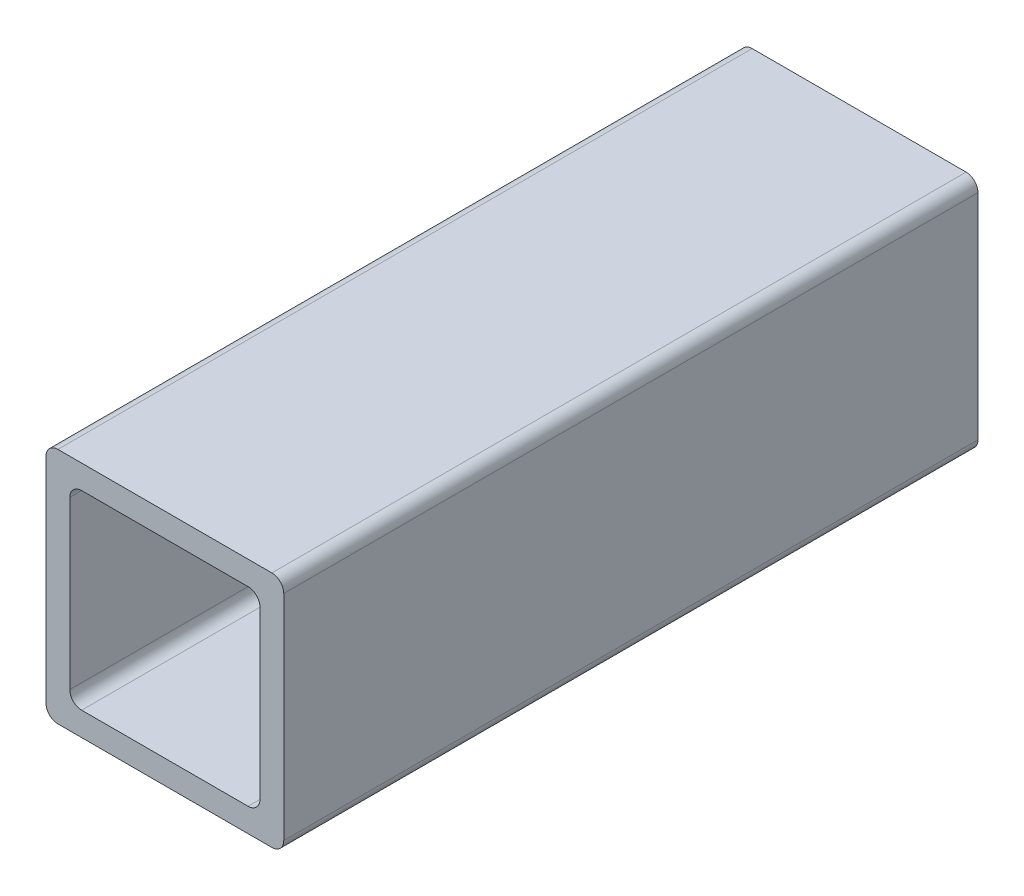
ISO-10303-21;
HEADER;
FILE_DESCRIPTION(('STEP AP214'),'2;1');
FILE_NAME('part.step','',(''),(''),'','','');
FILE_SCHEMA(('AUTOMOTIVE_DESIGN { 1 0 10303 214 1 1 1 1 }'));
ENDSEC;
DATA;
#1=APPLICATION_CONTEXT('core data for automotive mechanical design processes');
#2=APPLICATION_PROTOCOL_DEFINITION('international standard','automotive_design',2000,#1);
#3=PRODUCT_CONTEXT('',#1,'mechanical');
#4=PRODUCT('Part','Part','',(#3));
#5=PRODUCT_RELATED_PRODUCT_CATEGORY('part','',(#4));
#6=PRODUCT_DEFINITION_FORMATION('','',#4);
#7=PRODUCT_DEFINITION_CONTEXT('part definition',#1,'design');
#8=PRODUCT_DEFINITION('design','',#6,#7);
#9=PRODUCT_DEFINITION_SHAPE('','',#8);
#10=(LENGTH_UNIT() NAMED_UNIT(*) SI_UNIT(.MILLI.,.METRE.));
#11=(NAMED_UNIT(*) PLANE_ANGLE_UNIT() SI_UNIT($,.RADIAN.));
#12=(NAMED_UNIT(*) SI_UNIT($,.STERADIAN.) SOLID_ANGLE_UNIT());
#13=UNCERTAINTY_MEASURE_WITH_UNIT(LENGTH_MEASURE(1.E-05),#10,'distance_accuracy_value','');
#14=(GEOMETRIC_REPRESENTATION_CONTEXT(3) GLOBAL_UNCERTAINTY_ASSIGNED_CONTEXT((#13)) GLOBAL_UNIT_ASSIGNED_CONTEXT((#10,
#11,#12)) REPRESENTATION_CONTEXT('',''));
#15=CARTESIAN_POINT('',(0.,0.,0.));
#16=DIRECTION('',(0.,0.,1.));
#17=DIRECTION('',(1.,0.,0.));
#18=AXIS2_PLACEMENT_3D('',#15,#16,#17);
#19=CARTESIAN_POINT('',(0.,0.,-3.048));
#20=DIRECTION('',(0.,0.,1.));
#21=DIRECTION('',(1.,0.,0.));
#22=AXIS2_PLACEMENT_3D('',#19,#20,#21);
#23=PLANE('',#22);
#24=DIRECTION('',(0.,1.,0.));
#25=VECTOR('',#24,1.);
#26=CARTESIAN_POINT('',(12.7,-12.7,-3.048));
#27=LINE('',#26,#25);
#28=CARTESIAN_POINT('',(12.7,-11.43,-3.048));
#29=VERTEX_POINT('',#28);
#30=CARTESIAN_POINT('',(12.7,11.43,-3.048));
#31=VERTEX_POINT('',#30);
#32=EDGE_CURVE('E311',#29,#31,#27,.T.);
#33=ORIENTED_EDGE('',*,*,#32,.F.);
#34=CARTESIAN_POINT('',(11.43,-11.43,-3.048));
#35=DIRECTION('',(0.,0.,1.));
#36=DIRECTION('',(1.,0.,0.));
#37=AXIS2_PLACEMENT_3D('',#34,#35,#36);
#38=CIRCLE('',#37,1.27);
#39=CARTESIAN_POINT('',(11.43,-12.7,-3.048));
#40=VERTEX_POINT('',#39);
#41=EDGE_CURVE('E230',#29,#40,#38,.F.);
#42=ORIENTED_EDGE('',*,*,#41,.T.);
#43=DIRECTION('',(1.,0.,0.));
#44=VECTOR('',#43,1.);
#45=CARTESIAN_POINT('',(12.7,-12.7,-3.048));
#46=LINE('',#45,#44);
#47=CARTESIAN_POINT('',(-11.43,-12.7,-3.048));
#48=VERTEX_POINT('',#47);
#49=EDGE_CURVE('E316',#48,#40,#46,.T.);
#50=ORIENTED_EDGE('',*,*,#49,.F.);
#51=CARTESIAN_POINT('',(-11.43,-11.43,-3.048));
#52=DIRECTION('',(0.,0.,1.));
#53=DIRECTION('',(1.,0.,0.));
#54=AXIS2_PLACEMENT_3D('',#51,#52,#53);
#55=CIRCLE('',#54,1.27);
#56=CARTESIAN_POINT('',(-12.7,-11.43,-3.048));
#57=VERTEX_POINT('',#56);
#58=EDGE_CURVE('E227',#48,#57,#55,.F.);
#59=ORIENTED_EDGE('',*,*,#58,.T.);
#60=DIRECTION('',(0.,-1.,0.));
#61=VECTOR('',#60,1.);
#62=CARTESIAN_POINT('',(-12.7,-12.7,-3.048));
#63=LINE('',#62,#61);
#64=CARTESIAN_POINT('',(-12.7,11.43,-3.048));
#65=VERTEX_POINT('',#64);
#66=EDGE_CURVE('E321',#65,#57,#63,.T.);
#67=ORIENTED_EDGE('',*,*,#66,.F.);
#68=CARTESIAN_POINT('',(-11.43,11.43,-3.048));
#69=DIRECTION('',(0.,0.,1.));
#70=DIRECTION('',(1.,0.,0.));
#71=AXIS2_PLACEMENT_3D('',#68,#69,#70);
#72=CIRCLE('',#71,1.27);
#73=CARTESIAN_POINT('',(-11.43,12.7,-3.048));
#74=VERTEX_POINT('',#73);
#75=EDGE_CURVE('E221',#65,#74,#72,.F.);
#76=ORIENTED_EDGE('',*,*,#75,.T.);
#77=DIRECTION('',(-1.,0.,0.));
#78=VECTOR('',#77,1.);
#79=CARTESIAN_POINT('',(12.7,12.7,-3.048));
#80=LINE('',#79,#78);
#81=CARTESIAN_POINT('',(11.43,12.7,-3.048));
#82=VERTEX_POINT('',#81);
#83=EDGE_CURVE('E183',#82,#74,#80,.T.);
#84=ORIENTED_EDGE('',*,*,#83,.F.);
#85=CARTESIAN_POINT('',(11.43,11.43,-3.048));
#86=DIRECTION('',(0.,0.,1.));
#87=DIRECTION('',(1.,0.,0.));
#88=AXIS2_PLACEMENT_3D('',#85,#86,#87);
#89=CIRCLE('',#88,1.27);
#90=EDGE_CURVE('E224',#82,#31,#89,.F.);
#91=ORIENTED_EDGE('',*,*,#90,.T.);
#92=EDGE_LOOP('',(#33,#42,#50,#59,#67,#76,#84,#91));
#93=FACE_BOUND('',#92,.T.);
#94=DIRECTION('',(-1.,0.,0.));
#95=VECTOR('',#94,1.);
#96=CARTESIAN_POINT('',(10.16,10.16,-3.048));
#97=LINE('',#96,#95);
#98=CARTESIAN_POINT('',(8.89,10.16,-3.048));
#99=VERTEX_POINT('',#98);
#100=CARTESIAN_POINT('',(-8.89,10.16,-3.048));
#101=VERTEX_POINT('',#100);
#102=EDGE_CURVE('E295',#99,#101,#97,.T.);
#103=ORIENTED_EDGE('',*,*,#102,.T.);
#104=CARTESIAN_POINT('',(-8.89,8.89,-3.048));
#105=DIRECTION('',(0.,0.,1.));
#106=DIRECTION('',(1.,0.,0.));
#107=AXIS2_PLACEMENT_3D('',#104,#105,#106);
#108=CIRCLE('',#107,1.27);
#109=CARTESIAN_POINT('',(-10.16,8.89,-3.048));
#110=VERTEX_POINT('',#109);
#111=EDGE_CURVE('E271',#101,#110,#108,.T.);
#112=ORIENTED_EDGE('',*,*,#111,.T.);
#113=DIRECTION('',(0.,-1.,0.));
#114=VECTOR('',#113,1.);
#115=CARTESIAN_POINT('',(-10.16,-10.16,-3.048));
#116=LINE('',#115,#114);
#117=CARTESIAN_POINT('',(-10.16,-8.89,-3.048));
#118=VERTEX_POINT('',#117);
#119=EDGE_CURVE('E328',#110,#118,#116,.T.);
#120=ORIENTED_EDGE('',*,*,#119,.T.);
#121=CARTESIAN_POINT('',(-8.89,-8.89,-3.048));
#122=DIRECTION('',(0.,0.,1.));
#123=DIRECTION('',(1.,0.,0.));
#124=AXIS2_PLACEMENT_3D('',#121,#122,#123);
#125=CIRCLE('',#124,1.27);
#126=CARTESIAN_POINT('',(-8.89,-10.16,-3.048));
#127=VERTEX_POINT('',#126);
#128=EDGE_CURVE('E171',#118,#127,#125,.T.);
#129=ORIENTED_EDGE('',*,*,#128,.T.);
#130=DIRECTION('',(1.,0.,0.));
#131=VECTOR('',#130,1.);
#132=CARTESIAN_POINT('',(10.16,-10.16,-3.048));
#133=LINE('',#132,#131);
#134=CARTESIAN_POINT('',(8.89,-10.16,-3.048));
#135=VERTEX_POINT('',#134);
#136=EDGE_CURVE('E285',#127,#135,#133,.T.);
#137=ORIENTED_EDGE('',*,*,#136,.T.);
#138=CARTESIAN_POINT('',(8.89,-8.89,-3.048));
#139=DIRECTION('',(0.,0.,1.));
#140=DIRECTION('',(1.,0.,0.));
#141=AXIS2_PLACEMENT_3D('',#138,#139,#140);
#142=CIRCLE('',#141,1.27);
#143=CARTESIAN_POINT('',(10.16,-8.89,-3.048));
#144=VERTEX_POINT('',#143);
#145=EDGE_CURVE('E52',#135,#144,#142,.T.);
#146=ORIENTED_EDGE('',*,*,#145,.T.);
#147=DIRECTION('',(0.,1.,0.));
#148=VECTOR('',#147,1.);
#149=CARTESIAN_POINT('',(10.16,-10.16,-3.048));
#150=LINE('',#149,#148);
#151=CARTESIAN_POINT('',(10.16,8.89,-3.048));
#152=VERTEX_POINT('',#151);
#153=EDGE_CURVE('E283',#144,#152,#150,.T.);
#154=ORIENTED_EDGE('',*,*,#153,.T.);
#155=CARTESIAN_POINT('',(8.89,8.89,-3.048));
#156=DIRECTION('',(0.,0.,1.));
#157=DIRECTION('',(1.,0.,0.));
#158=AXIS2_PLACEMENT_3D('',#155,#156,#157);
#159=CIRCLE('',#158,1.27);
#160=EDGE_CURVE('E170',#152,#99,#159,.T.);
#161=ORIENTED_EDGE('',*,*,#160,.T.);
#162=EDGE_LOOP('',(#103,#112,#120,#129,#137,#146,#154,#161));
#163=FACE_BOUND('',#162,.T.);
#164=ADVANCED_FACE('F43',(#93,#163),#23,.F.);
#165=CARTESIAN_POINT('',(-12.7,-12.7,107.041024484277));
#166=DIRECTION('',(1.,0.,0.));
#167=DIRECTION('',(0.,0.,-1.));
#168=AXIS2_PLACEMENT_3D('',#165,#166,#167);
#169=PLANE('',#168);
#170=ORIENTED_EDGE('',*,*,#66,.T.);
#171=DIRECTION('',(0.,0.,-1.));
#172=VECTOR('',#171,1.);
#173=CARTESIAN_POINT('',(-12.7,-11.43,107.041024484277));
#174=LINE('',#173,#172);
#175=CARTESIAN_POINT('',(-12.7,-11.43,71.12));
#176=VERTEX_POINT('',#175);
#177=EDGE_CURVE('E66',#57,#176,#174,.F.);
#178=ORIENTED_EDGE('',*,*,#177,.T.);
#179=DIRECTION('',(0.,1.,0.));
#180=VECTOR('',#179,1.);
#181=CARTESIAN_POINT('',(-12.7,-12.7,71.12));
#182=LINE('',#181,#180);
#183=CARTESIAN_POINT('',(-12.7,11.43,71.12));
#184=VERTEX_POINT('',#183);
#185=EDGE_CURVE('E322',#176,#184,#182,.T.);
#186=ORIENTED_EDGE('',*,*,#185,.T.);
#187=DIRECTION('',(0.,0.,-1.));
#188=VECTOR('',#187,1.);
#189=CARTESIAN_POINT('',(-12.7,11.43,107.041024484277));
#190=LINE('',#189,#188);
#191=EDGE_CURVE('E251',#184,#65,#190,.T.);
#192=ORIENTED_EDGE('',*,*,#191,.T.);
#193=EDGE_LOOP('',(#170,#178,#186,#192));
#194=FACE_BOUND('',#193,.T.);
#195=ADVANCED_FACE('F355',(#194),#169,.F.);
#196=CARTESIAN_POINT('',(12.7,-12.7,107.041024484277));
#197=DIRECTION('',(0.,1.,0.));
#198=DIRECTION('',(0.,0.,1.));
#199=AXIS2_PLACEMENT_3D('',#196,#197,#198);
#200=PLANE('',#199);
#201=ORIENTED_EDGE('',*,*,#49,.T.);
#202=DIRECTION('',(0.,0.,-1.));
#203=VECTOR('',#202,1.);
#204=CARTESIAN_POINT('',(11.43,-12.7,107.041024484277));
#205=LINE('',#204,#203);
#206=CARTESIAN_POINT('',(11.43,-12.7,71.12));
#207=VERTEX_POINT('',#206);
#208=EDGE_CURVE('E237',#40,#207,#205,.F.);
#209=ORIENTED_EDGE('',*,*,#208,.T.);
#210=DIRECTION('',(-1.,0.,0.));
#211=VECTOR('',#210,1.);
#212=CARTESIAN_POINT('',(12.7,-12.7,71.12));
#213=LINE('',#212,#211);
#214=CARTESIAN_POINT('',(-11.43,-12.7,71.12));
#215=VERTEX_POINT('',#214);
#216=EDGE_CURVE('E317',#207,#215,#213,.T.);
#217=ORIENTED_EDGE('',*,*,#216,.T.);
#218=DIRECTION('',(0.,0.,-1.));
#219=VECTOR('',#218,1.);
#220=CARTESIAN_POINT('',(-11.43,-12.7,107.041024484277));
#221=LINE('',#220,#219);
#222=EDGE_CURVE('E233',#215,#48,#221,.T.);
#223=ORIENTED_EDGE('',*,*,#222,.T.);
#224=EDGE_LOOP('',(#201,#209,#217,#223));
#225=FACE_BOUND('',#224,.T.);
#226=ADVANCED_FACE('F363',(#225),#200,.F.);
#227=CARTESIAN_POINT('',(12.7,-12.7,107.041024484277));
#228=DIRECTION('',(-1.,0.,0.));
#229=DIRECTION('',(0.,0.,1.));
#230=AXIS2_PLACEMENT_3D('',#227,#228,#229);
#231=PLANE('',#230);
#232=DIRECTION('',(0.,-1.,0.));
#233=VECTOR('',#232,1.);
#234=CARTESIAN_POINT('',(12.7,-12.7,71.12));
#235=LINE('',#234,#233);
#236=CARTESIAN_POINT('',(12.7,11.43,71.12));
#237=VERTEX_POINT('',#236);
#238=CARTESIAN_POINT('',(12.7,-11.43,71.12));
#239=VERTEX_POINT('',#238);
#240=EDGE_CURVE('E312',#237,#239,#235,.T.);
#241=ORIENTED_EDGE('',*,*,#240,.T.);
#242=DIRECTION('',(0.,0.,-1.));
#243=VECTOR('',#242,1.);
#244=CARTESIAN_POINT('',(12.7,-11.43,107.041024484277));
#245=LINE('',#244,#243);
#246=EDGE_CURVE('E217',#239,#29,#245,.T.);
#247=ORIENTED_EDGE('',*,*,#246,.T.);
#248=ORIENTED_EDGE('',*,*,#32,.T.);
#249=DIRECTION('',(0.,0.,-1.));
#250=VECTOR('',#249,1.);
#251=CARTESIAN_POINT('',(12.7,11.43,107.041024484277));
#252=LINE('',#251,#250);
#253=EDGE_CURVE('E214',#31,#237,#252,.F.);
#254=ORIENTED_EDGE('',*,*,#253,.T.);
#255=EDGE_LOOP('',(#241,#247,#248,#254));
#256=FACE_BOUND('',#255,.T.);
#257=ADVANCED_FACE('F372',(#256),#231,.F.);
#258=CARTESIAN_POINT('',(12.7,12.7,107.041024484277));
#259=DIRECTION('',(0.,-1.,0.));
#260=DIRECTION('',(0.,0.,-1.));
#261=AXIS2_PLACEMENT_3D('',#258,#259,#260);
#262=PLANE('',#261);
#263=DIRECTION('',(1.,0.,0.));
#264=VECTOR('',#263,1.);
#265=CARTESIAN_POINT('',(12.7,12.7,71.12));
#266=LINE('',#265,#264);
#267=CARTESIAN_POINT('',(-11.43,12.7,71.12));
#268=VERTEX_POINT('',#267);
#269=CARTESIAN_POINT('',(11.43,12.7,71.12));
#270=VERTEX_POINT('',#269);
#271=EDGE_CURVE('E307',#268,#270,#266,.T.);
#272=ORIENTED_EDGE('',*,*,#271,.T.);
#273=DIRECTION('',(0.,0.,-1.));
#274=VECTOR('',#273,1.);
#275=CARTESIAN_POINT('',(11.43,12.7,107.041024484277));
#276=LINE('',#275,#274);
#277=EDGE_CURVE('E260',#270,#82,#276,.T.);
#278=ORIENTED_EDGE('',*,*,#277,.T.);
#279=ORIENTED_EDGE('',*,*,#83,.T.);
#280=DIRECTION('',(0.,0.,-1.));
#281=VECTOR('',#280,1.);
#282=CARTESIAN_POINT('',(-11.43,12.7,107.041024484277));
#283=LINE('',#282,#281);
#284=EDGE_CURVE('E257',#74,#268,#283,.F.);
#285=ORIENTED_EDGE('',*,*,#284,.T.);
#286=EDGE_LOOP('',(#272,#278,#279,#285));
#287=FACE_BOUND('',#286,.T.);
#288=ADVANCED_FACE('F349',(#287),#262,.F.);
#289=CARTESIAN_POINT('',(-10.16,-10.16,107.041024484277));
#290=DIRECTION('',(1.,0.,0.));
#291=DIRECTION('',(0.,0.,-1.));
#292=AXIS2_PLACEMENT_3D('',#289,#290,#291);
#293=PLANE('',#292);
#294=DIRECTION('',(0.,1.,0.));
#295=VECTOR('',#294,1.);
#296=CARTESIAN_POINT('',(-10.16,-10.16,71.12));
#297=LINE('',#296,#295);
#298=CARTESIAN_POINT('',(-10.16,-8.89,71.12));
#299=VERTEX_POINT('',#298);
#300=CARTESIAN_POINT('',(-10.16,8.89,71.12));
#301=VERTEX_POINT('',#300);
#302=EDGE_CURVE('E162',#299,#301,#297,.T.);
#303=ORIENTED_EDGE('',*,*,#302,.F.);
#304=DIRECTION('',(0.,0.,-1.));
#305=VECTOR('',#304,1.);
#306=CARTESIAN_POINT('',(-10.16,-8.89,-3.048));
#307=LINE('',#306,#305);
#308=EDGE_CURVE('E177',#299,#118,#307,.T.);
#309=ORIENTED_EDGE('',*,*,#308,.T.);
#310=ORIENTED_EDGE('',*,*,#119,.F.);
#311=DIRECTION('',(0.,0.,-1.));
#312=VECTOR('',#311,1.);
#313=CARTESIAN_POINT('',(-10.16,8.89,71.12));
#314=LINE('',#313,#312);
#315=EDGE_CURVE('E180',#110,#301,#314,.F.);
#316=ORIENTED_EDGE('',*,*,#315,.T.);
#317=EDGE_LOOP('',(#303,#309,#310,#316));
#318=FACE_BOUND('',#317,.T.);
#319=ADVANCED_FACE('F175',(#318),#293,.T.);
#320=CARTESIAN_POINT('',(10.16,-10.16,107.041024484277));
#321=DIRECTION('',(0.,1.,0.));
#322=DIRECTION('',(0.,0.,1.));
#323=AXIS2_PLACEMENT_3D('',#320,#321,#322);
#324=PLANE('',#323);
#325=ORIENTED_EDGE('',*,*,#136,.F.);
#326=DIRECTION('',(0.,0.,-1.));
#327=VECTOR('',#326,1.);
#328=CARTESIAN_POINT('',(-8.89,-10.16,71.12));
#329=LINE('',#328,#327);
#330=CARTESIAN_POINT('',(-8.89,-10.16,71.12));
#331=VERTEX_POINT('',#330);
#332=EDGE_CURVE('E193',#127,#331,#329,.F.);
#333=ORIENTED_EDGE('',*,*,#332,.T.);
#334=DIRECTION('',(-1.,0.,0.));
#335=VECTOR('',#334,1.);
#336=CARTESIAN_POINT('',(10.16,-10.16,71.12));
#337=LINE('',#336,#335);
#338=CARTESIAN_POINT('',(8.89,-10.16,71.12));
#339=VERTEX_POINT('',#338);
#340=EDGE_CURVE('E165',#339,#331,#337,.T.);
#341=ORIENTED_EDGE('',*,*,#340,.F.);
#342=DIRECTION('',(0.,0.,-1.));
#343=VECTOR('',#342,1.);
#344=CARTESIAN_POINT('',(8.89,-10.16,-3.048));
#345=LINE('',#344,#343);
#346=EDGE_CURVE('E187',#339,#135,#345,.T.);
#347=ORIENTED_EDGE('',*,*,#346,.T.);
#348=EDGE_LOOP('',(#325,#333,#341,#347));
#349=FACE_BOUND('',#348,.T.);
#350=ADVANCED_FACE('F301',(#349),#324,.T.);
#351=CARTESIAN_POINT('',(10.16,-10.16,107.041024484277));
#352=DIRECTION('',(-1.,0.,0.));
#353=DIRECTION('',(0.,0.,1.));
#354=AXIS2_PLACEMENT_3D('',#351,#352,#353);
#355=PLANE('',#354);
#356=DIRECTION('',(0.,-1.,0.));
#357=VECTOR('',#356,1.);
#358=CARTESIAN_POINT('',(10.16,-10.16,71.12));
#359=LINE('',#358,#357);
#360=CARTESIAN_POINT('',(10.16,8.89,71.12));
#361=VERTEX_POINT('',#360);
#362=CARTESIAN_POINT('',(10.16,-8.89,71.12));
#363=VERTEX_POINT('',#362);
#364=EDGE_CURVE('E299',#361,#363,#359,.T.);
#365=ORIENTED_EDGE('',*,*,#364,.F.);
#366=DIRECTION('',(0.,0.,-1.));
#367=VECTOR('',#366,1.);
#368=CARTESIAN_POINT('',(10.16,8.89,-3.048));
#369=LINE('',#368,#367);
#370=EDGE_CURVE('E203',#361,#152,#369,.T.);
#371=ORIENTED_EDGE('',*,*,#370,.T.);
#372=ORIENTED_EDGE('',*,*,#153,.F.);
#373=DIRECTION('',(0.,0.,-1.));
#374=VECTOR('',#373,1.);
#375=CARTESIAN_POINT('',(10.16,-8.89,71.12));
#376=LINE('',#375,#374);
#377=EDGE_CURVE('E200',#144,#363,#376,.F.);
#378=ORIENTED_EDGE('',*,*,#377,.T.);
#379=EDGE_LOOP('',(#365,#371,#372,#378));
#380=FACE_BOUND('',#379,.T.);
#381=ADVANCED_FACE('F291',(#380),#355,.T.);
#382=CARTESIAN_POINT('',(10.16,10.16,107.041024484277));
#383=DIRECTION('',(0.,-1.,0.));
#384=DIRECTION('',(0.,0.,-1.));
#385=AXIS2_PLACEMENT_3D('',#382,#383,#384);
#386=PLANE('',#385);
#387=ORIENTED_EDGE('',*,*,#102,.F.);
#388=DIRECTION('',(0.,0.,-1.));
#389=VECTOR('',#388,1.);
#390=CARTESIAN_POINT('',(8.89,10.16,71.12));
#391=LINE('',#390,#389);
#392=CARTESIAN_POINT('',(8.89,10.16,71.12));
#393=VERTEX_POINT('',#392);
#394=EDGE_CURVE('E211',#99,#393,#391,.F.);
#395=ORIENTED_EDGE('',*,*,#394,.T.);
#396=DIRECTION('',(1.,0.,0.));
#397=VECTOR('',#396,1.);
#398=CARTESIAN_POINT('',(10.16,10.16,71.12));
#399=LINE('',#398,#397);
#400=CARTESIAN_POINT('',(-8.89,10.16,71.12));
#401=VERTEX_POINT('',#400);
#402=EDGE_CURVE('E182',#401,#393,#399,.T.);
#403=ORIENTED_EDGE('',*,*,#402,.F.);
#404=DIRECTION('',(0.,0.,-1.));
#405=VECTOR('',#404,1.);
#406=CARTESIAN_POINT('',(-8.89,10.16,-3.048));
#407=LINE('',#406,#405);
#408=EDGE_CURVE('E207',#401,#101,#407,.T.);
#409=ORIENTED_EDGE('',*,*,#408,.T.);
#410=EDGE_LOOP('',(#387,#395,#403,#409));
#411=FACE_BOUND('',#410,.T.);
#412=ADVANCED_FACE('F396',(#411),#386,.T.);
#413=CARTESIAN_POINT('',(0.,0.,71.12));
#414=DIRECTION('',(0.,0.,-1.));
#415=DIRECTION('',(-1.,0.,0.));
#416=AXIS2_PLACEMENT_3D('',#413,#414,#415);
#417=PLANE('',#416);
#418=ORIENTED_EDGE('',*,*,#340,.T.);
#419=CARTESIAN_POINT('',(-8.89,-8.89,71.12));
#420=DIRECTION('',(0.,0.,-1.));
#421=DIRECTION('',(-1.,0.,0.));
#422=AXIS2_PLACEMENT_3D('',#419,#420,#421);
#423=CIRCLE('',#422,1.27);
#424=EDGE_CURVE('E159',#331,#299,#423,.T.);
#425=ORIENTED_EDGE('',*,*,#424,.T.);
#426=ORIENTED_EDGE('',*,*,#302,.T.);
#427=CARTESIAN_POINT('',(-8.89,8.89,71.12));
#428=DIRECTION('',(0.,0.,-1.));
#429=DIRECTION('',(-1.,0.,0.));
#430=AXIS2_PLACEMENT_3D('',#427,#428,#429);
#431=CIRCLE('',#430,1.27);
#432=EDGE_CURVE('E274',#301,#401,#431,.T.);
#433=ORIENTED_EDGE('',*,*,#432,.T.);
#434=ORIENTED_EDGE('',*,*,#402,.T.);
#435=CARTESIAN_POINT('',(8.89,8.89,71.12));
#436=DIRECTION('',(0.,0.,-1.));
#437=DIRECTION('',(-1.,0.,0.));
#438=AXIS2_PLACEMENT_3D('',#435,#436,#437);
#439=CIRCLE('',#438,1.27);
#440=EDGE_CURVE('E268',#393,#361,#439,.T.);
#441=ORIENTED_EDGE('',*,*,#440,.T.);
#442=ORIENTED_EDGE('',*,*,#364,.T.);
#443=CARTESIAN_POINT('',(8.89,-8.89,71.12));
#444=DIRECTION('',(0.,0.,-1.));
#445=DIRECTION('',(-1.,0.,0.));
#446=AXIS2_PLACEMENT_3D('',#443,#444,#445);
#447=CIRCLE('',#446,1.27);
#448=EDGE_CURVE('E11',#363,#339,#447,.T.);
#449=ORIENTED_EDGE('',*,*,#448,.T.);
#450=EDGE_LOOP('',(#418,#425,#426,#433,#434,#441,#442,#449));
#451=FACE_BOUND('',#450,.T.);
#452=ORIENTED_EDGE('',*,*,#216,.F.);
#453=CARTESIAN_POINT('',(11.43,-11.43,71.12));
#454=DIRECTION('',(0.,0.,-1.));
#455=DIRECTION('',(-1.,0.,0.));
#456=AXIS2_PLACEMENT_3D('',#453,#454,#455);
#457=CIRCLE('',#456,1.27);
#458=EDGE_CURVE('E248',#207,#239,#457,.F.);
#459=ORIENTED_EDGE('',*,*,#458,.T.);
#460=ORIENTED_EDGE('',*,*,#240,.F.);
#461=CARTESIAN_POINT('',(11.43,11.43,71.12));
#462=DIRECTION('',(0.,0.,-1.));
#463=DIRECTION('',(-1.,0.,0.));
#464=AXIS2_PLACEMENT_3D('',#461,#462,#463);
#465=CIRCLE('',#464,1.27);
#466=EDGE_CURVE('E242',#237,#270,#465,.F.);
#467=ORIENTED_EDGE('',*,*,#466,.T.);
#468=ORIENTED_EDGE('',*,*,#271,.F.);
#469=CARTESIAN_POINT('',(-11.43,11.43,71.12));
#470=DIRECTION('',(0.,0.,-1.));
#471=DIRECTION('',(-1.,0.,0.));
#472=AXIS2_PLACEMENT_3D('',#469,#470,#471);
#473=CIRCLE('',#472,1.27);
#474=EDGE_CURVE('E59',#268,#184,#473,.F.);
#475=ORIENTED_EDGE('',*,*,#474,.T.);
#476=ORIENTED_EDGE('',*,*,#185,.F.);
#477=CARTESIAN_POINT('',(-11.43,-11.43,71.12));
#478=DIRECTION('',(0.,0.,-1.));
#479=DIRECTION('',(-1.,0.,0.));
#480=AXIS2_PLACEMENT_3D('',#477,#478,#479);
#481=CIRCLE('',#480,1.27);
#482=EDGE_CURVE('E245',#176,#215,#481,.F.);
#483=ORIENTED_EDGE('',*,*,#482,.T.);
#484=EDGE_LOOP('',(#452,#459,#460,#467,#468,#475,#476,#483));
#485=FACE_BOUND('',#484,.T.);
#486=ADVANCED_FACE('F161',(#451,#485),#417,.F.);
#487=CARTESIAN_POINT('',(-8.89,-8.89,107.041024484277));
#488=DIRECTION('',(0.,0.,1.));
#489=DIRECTION('',(1.,0.,0.));
#490=AXIS2_PLACEMENT_3D('',#487,#488,#489);
#491=CYLINDRICAL_SURFACE('',#490,1.27);
#492=ORIENTED_EDGE('',*,*,#424,.F.);
#493=ORIENTED_EDGE('',*,*,#332,.F.);
#494=ORIENTED_EDGE('',*,*,#128,.F.);
#495=ORIENTED_EDGE('',*,*,#308,.F.);
#496=EDGE_LOOP('',(#492,#493,#494,#495));
#497=FACE_BOUND('',#496,.T.);
#498=ADVANCED_FACE('F185',(#497),#491,.F.);
#499=CARTESIAN_POINT('',(8.89,8.89,107.041024484277));
#500=DIRECTION('',(0.,0.,1.));
#501=DIRECTION('',(1.,0.,0.));
#502=AXIS2_PLACEMENT_3D('',#499,#500,#501);
#503=CYLINDRICAL_SURFACE('',#502,1.27);
#504=ORIENTED_EDGE('',*,*,#440,.F.);
#505=ORIENTED_EDGE('',*,*,#394,.F.);
#506=ORIENTED_EDGE('',*,*,#160,.F.);
#507=ORIENTED_EDGE('',*,*,#370,.F.);
#508=EDGE_LOOP('',(#504,#505,#506,#507));
#509=FACE_BOUND('',#508,.T.);
#510=ADVANCED_FACE('F410',(#509),#503,.F.);
#511=CARTESIAN_POINT('',(-8.89,8.89,107.041024484277));
#512=DIRECTION('',(0.,0.,1.));
#513=DIRECTION('',(1.,0.,0.));
#514=AXIS2_PLACEMENT_3D('',#511,#512,#513);
#515=CYLINDRICAL_SURFACE('',#514,1.27);
#516=ORIENTED_EDGE('',*,*,#432,.F.);
#517=ORIENTED_EDGE('',*,*,#315,.F.);
#518=ORIENTED_EDGE('',*,*,#111,.F.);
#519=ORIENTED_EDGE('',*,*,#408,.F.);
#520=EDGE_LOOP('',(#516,#517,#518,#519));
#521=FACE_BOUND('',#520,.T.);
#522=ADVANCED_FACE('F413',(#521),#515,.F.);
#523=CARTESIAN_POINT('',(8.89,-8.89,107.041024484277));
#524=DIRECTION('',(0.,0.,1.));
#525=DIRECTION('',(1.,0.,0.));
#526=AXIS2_PLACEMENT_3D('',#523,#524,#525);
#527=CYLINDRICAL_SURFACE('',#526,1.27);
#528=ORIENTED_EDGE('',*,*,#448,.F.);
#529=ORIENTED_EDGE('',*,*,#377,.F.);
#530=ORIENTED_EDGE('',*,*,#145,.F.);
#531=ORIENTED_EDGE('',*,*,#346,.F.);
#532=EDGE_LOOP('',(#528,#529,#530,#531));
#533=FACE_BOUND('',#532,.T.);
#534=ADVANCED_FACE('F298',(#533),#527,.F.);
#535=CARTESIAN_POINT('',(11.43,-11.43,107.041024484277));
#536=DIRECTION('',(0.,0.,-1.));
#537=DIRECTION('',(-1.,0.,0.));
#538=AXIS2_PLACEMENT_3D('',#535,#536,#537);
#539=CYLINDRICAL_SURFACE('',#538,1.27);
#540=ORIENTED_EDGE('',*,*,#458,.F.);
#541=ORIENTED_EDGE('',*,*,#208,.F.);
#542=ORIENTED_EDGE('',*,*,#41,.F.);
#543=ORIENTED_EDGE('',*,*,#246,.F.);
#544=EDGE_LOOP('',(#540,#541,#542,#543));
#545=FACE_BOUND('',#544,.T.);
#546=ADVANCED_FACE('F370',(#545),#539,.T.);
#547=CARTESIAN_POINT('',(-11.43,-11.43,107.041024484277));
#548=DIRECTION('',(0.,0.,-1.));
#549=DIRECTION('',(-1.,0.,0.));
#550=AXIS2_PLACEMENT_3D('',#547,#548,#549);
#551=CYLINDRICAL_SURFACE('',#550,1.27);
#552=ORIENTED_EDGE('',*,*,#482,.F.);
#553=ORIENTED_EDGE('',*,*,#177,.F.);
#554=ORIENTED_EDGE('',*,*,#58,.F.);
#555=ORIENTED_EDGE('',*,*,#222,.F.);
#556=EDGE_LOOP('',(#552,#553,#554,#555));
#557=FACE_BOUND('',#556,.T.);
#558=ADVANCED_FACE('F361',(#557),#551,.T.);
#559=CARTESIAN_POINT('',(11.43,11.43,107.041024484277));
#560=DIRECTION('',(0.,0.,-1.));
#561=DIRECTION('',(-1.,0.,0.));
#562=AXIS2_PLACEMENT_3D('',#559,#560,#561);
#563=CYLINDRICAL_SURFACE('',#562,1.27);
#564=ORIENTED_EDGE('',*,*,#466,.F.);
#565=ORIENTED_EDGE('',*,*,#253,.F.);
#566=ORIENTED_EDGE('',*,*,#90,.F.);
#567=ORIENTED_EDGE('',*,*,#277,.F.);
#568=EDGE_LOOP('',(#564,#565,#566,#567));
#569=FACE_BOUND('',#568,.T.);
#570=ADVANCED_FACE('F376',(#569),#563,.T.);
#571=CARTESIAN_POINT('',(-11.43,11.43,107.041024484277));
#572=DIRECTION('',(0.,0.,-1.));
#573=DIRECTION('',(-1.,0.,0.));
#574=AXIS2_PLACEMENT_3D('',#571,#572,#573);
#575=CYLINDRICAL_SURFACE('',#574,1.27);
#576=ORIENTED_EDGE('',*,*,#474,.F.);
#577=ORIENTED_EDGE('',*,*,#284,.F.);
#578=ORIENTED_EDGE('',*,*,#75,.F.);
#579=ORIENTED_EDGE('',*,*,#191,.F.);
#580=EDGE_LOOP('',(#576,#577,#578,#579));
#581=FACE_BOUND('',#580,.T.);
#582=ADVANCED_FACE('F45',(#581),#575,.T.);
#583=CLOSED_SHELL('',(#164,#195,#226,#257,#288,#319,#350,#381,#412,#486,#498,#510,#522,#534,
#546,#558,#570,#582));
#584=MANIFOLD_SOLID_BREP('B2',#583);
#585=ADVANCED_BREP_SHAPE_REPRESENTATION('',(#18,#584),#14);
#586=SHAPE_DEFINITION_REPRESENTATION(#9,#585);
ENDSEC;
END-ISO-10303-21;
